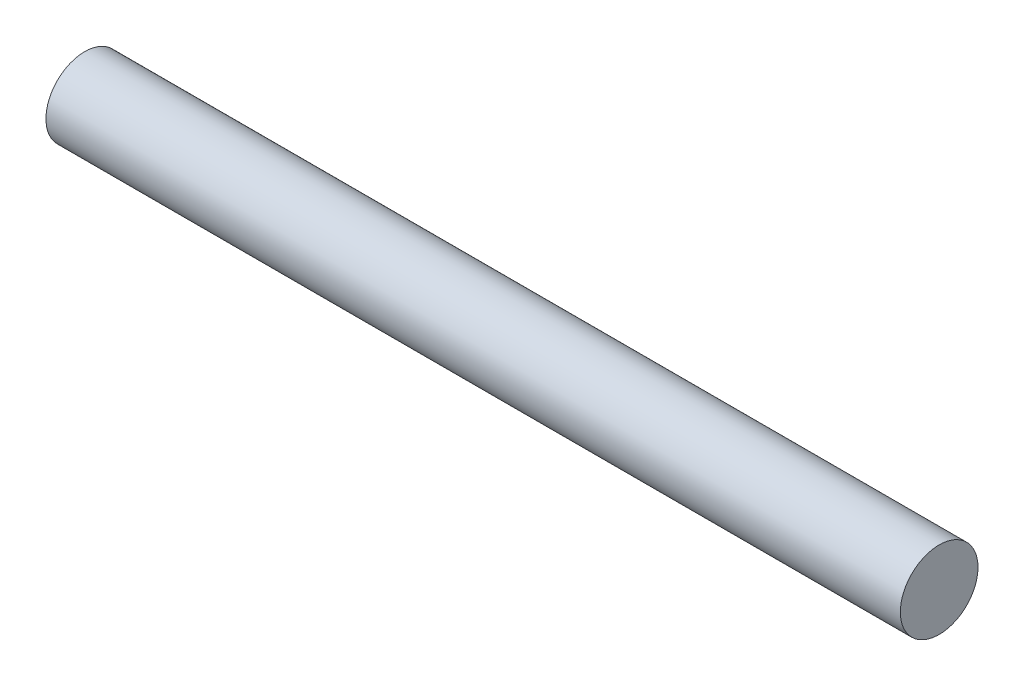
ISO-10303-21;
HEADER;
FILE_DESCRIPTION(('STEP AP214'),'2;1');
FILE_NAME('part.step','',(''),(''),'','','');
FILE_SCHEMA(('AUTOMOTIVE_DESIGN { 1 0 10303 214 1 1 1 1 }'));
ENDSEC;
DATA;
#1=APPLICATION_CONTEXT('core data for automotive mechanical design processes');
#2=APPLICATION_PROTOCOL_DEFINITION('international standard','automotive_design',2000,#1);
#3=PRODUCT_CONTEXT('',#1,'mechanical');
#4=PRODUCT('Part','Part','',(#3));
#5=PRODUCT_RELATED_PRODUCT_CATEGORY('part','',(#4));
#6=PRODUCT_DEFINITION_FORMATION('','',#4);
#7=PRODUCT_DEFINITION_CONTEXT('part definition',#1,'design');
#8=PRODUCT_DEFINITION('design','',#6,#7);
#9=PRODUCT_DEFINITION_SHAPE('','',#8);
#10=(LENGTH_UNIT() NAMED_UNIT(*) SI_UNIT(.MILLI.,.METRE.));
#11=(NAMED_UNIT(*) PLANE_ANGLE_UNIT() SI_UNIT($,.RADIAN.));
#12=(NAMED_UNIT(*) SI_UNIT($,.STERADIAN.) SOLID_ANGLE_UNIT());
#13=UNCERTAINTY_MEASURE_WITH_UNIT(LENGTH_MEASURE(1.E-05),#10,'distance_accuracy_value','');
#14=(GEOMETRIC_REPRESENTATION_CONTEXT(3) GLOBAL_UNCERTAINTY_ASSIGNED_CONTEXT((#13)) GLOBAL_UNIT_ASSIGNED_CONTEXT((#10,
#11,#12)) REPRESENTATION_CONTEXT('',''));
#15=CARTESIAN_POINT('',(0.,0.,0.));
#16=DIRECTION('',(0.,0.,1.));
#17=DIRECTION('',(1.,0.,0.));
#18=AXIS2_PLACEMENT_3D('',#15,#16,#17);
#19=CARTESIAN_POINT('',(55.88,0.,0.));
#20=DIRECTION('',(-1.,0.,0.));
#21=DIRECTION('',(0.,0.,1.));
#22=AXIS2_PLACEMENT_3D('',#19,#20,#21);
#23=CYLINDRICAL_SURFACE('',#22,2.54);
#24=CARTESIAN_POINT('',(55.88,0.,0.));
#25=DIRECTION('',(1.,0.,0.));
#26=DIRECTION('',(0.,0.,-1.));
#27=AXIS2_PLACEMENT_3D('',#24,#25,#26);
#28=CIRCLE('',#27,2.54);
#29=CARTESIAN_POINT('',(55.88,0.,-2.54));
#30=VERTEX_POINT('',#29);
#31=EDGE_CURVE('E10',#30,#30,#28,.T.);
#32=ORIENTED_EDGE('',*,*,#31,.F.);
#33=EDGE_LOOP('',(#32));
#34=FACE_BOUND('',#33,.T.);
#35=CARTESIAN_POINT('',(0.,0.,0.));
#36=DIRECTION('',(1.,0.,0.));
#37=DIRECTION('',(0.,0.,-1.));
#38=AXIS2_PLACEMENT_3D('',#35,#36,#37);
#39=CIRCLE('',#38,2.54);
#40=CARTESIAN_POINT('',(0.,0.,-2.54));
#41=VERTEX_POINT('',#40);
#42=EDGE_CURVE('E34',#41,#41,#39,.T.);
#43=ORIENTED_EDGE('',*,*,#42,.T.);
#44=EDGE_LOOP('',(#43));
#45=FACE_BOUND('',#44,.T.);
#46=ADVANCED_FACE('F31',(#34,#45),#23,.T.);
#47=CARTESIAN_POINT('',(55.88,0.,0.));
#48=DIRECTION('',(1.,0.,0.));
#49=DIRECTION('',(0.,0.,-1.));
#50=AXIS2_PLACEMENT_3D('',#47,#48,#49);
#51=PLANE('',#50);
#52=ORIENTED_EDGE('',*,*,#31,.T.);
#53=EDGE_LOOP('',(#52));
#54=FACE_BOUND('',#53,.T.);
#55=ADVANCED_FACE('F46',(#54),#51,.T.);
#56=CARTESIAN_POINT('',(0.,0.,0.));
#57=DIRECTION('',(1.,0.,0.));
#58=DIRECTION('',(0.,0.,-1.));
#59=AXIS2_PLACEMENT_3D('',#56,#57,#58);
#60=PLANE('',#59);
#61=ORIENTED_EDGE('',*,*,#42,.F.);
#62=EDGE_LOOP('',(#61));
#63=FACE_BOUND('',#62,.T.);
#64=ADVANCED_FACE('F44',(#63),#60,.F.);
#65=CLOSED_SHELL('',(#46,#55,#64));
#66=MANIFOLD_SOLID_BREP('B2',#65);
#67=ADVANCED_BREP_SHAPE_REPRESENTATION('',(#18,#66),#14);
#68=SHAPE_DEFINITION_REPRESENTATION(#9,#67);
ENDSEC;
END-ISO-10303-21;
